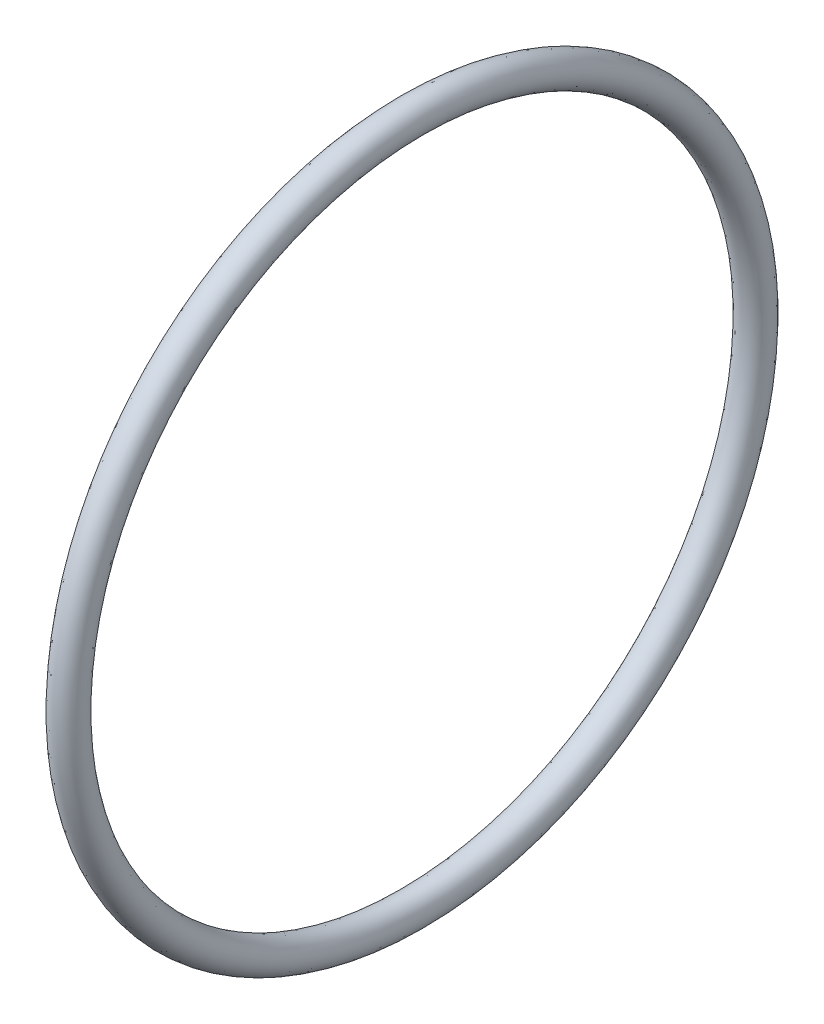
ISO-10303-21;
HEADER;
FILE_DESCRIPTION(('STEP AP214'),'2;1');
FILE_NAME('part.step','',(''),(''),'','','');
FILE_SCHEMA(('AUTOMOTIVE_DESIGN { 1 0 10303 214 1 1 1 1 }'));
ENDSEC;
DATA;
#1=APPLICATION_CONTEXT('core data for automotive mechanical design processes');
#2=APPLICATION_PROTOCOL_DEFINITION('international standard','automotive_design',2000,#1);
#3=PRODUCT_CONTEXT('',#1,'mechanical');
#4=PRODUCT('Part','Part','',(#3));
#5=PRODUCT_RELATED_PRODUCT_CATEGORY('part','',(#4));
#6=PRODUCT_DEFINITION_FORMATION('','',#4);
#7=PRODUCT_DEFINITION_CONTEXT('part definition',#1,'design');
#8=PRODUCT_DEFINITION('design','',#6,#7);
#9=PRODUCT_DEFINITION_SHAPE('','',#8);
#10=(LENGTH_UNIT() NAMED_UNIT(*) SI_UNIT(.MILLI.,.METRE.));
#11=(NAMED_UNIT(*) PLANE_ANGLE_UNIT() SI_UNIT($,.RADIAN.));
#12=(NAMED_UNIT(*) SI_UNIT($,.STERADIAN.) SOLID_ANGLE_UNIT());
#13=UNCERTAINTY_MEASURE_WITH_UNIT(LENGTH_MEASURE(1.E-05),#10,'distance_accuracy_value','');
#14=(GEOMETRIC_REPRESENTATION_CONTEXT(3) GLOBAL_UNCERTAINTY_ASSIGNED_CONTEXT((#13)) GLOBAL_UNIT_ASSIGNED_CONTEXT((#10,
#11,#12)) REPRESENTATION_CONTEXT('',''));
#15=CARTESIAN_POINT('',(0.,0.,0.));
#16=DIRECTION('',(0.,0.,1.));
#17=DIRECTION('',(1.,0.,0.));
#18=AXIS2_PLACEMENT_3D('',#15,#16,#17);
#19=CARTESIAN_POINT('',(0.,38.1381,0.));
#20=DIRECTION('',(0.,0.,1.));
#21=DIRECTION('',(0.,1.,0.));
#22=AXIS2_PLACEMENT_3D('',#19,#20,#21);
#23=ELLIPSE('',#22,1.7653,1.7653);
#24=CARTESIAN_POINT('',(0.,0.,0.));
#25=DIRECTION('',(1.,0.,0.));
#26=AXIS1_PLACEMENT('',#24,#25);
#27=SURFACE_OF_REVOLUTION('',#23,#26);
#28=ADVANCED_FACE('F33',(),#27,.F.);
#29=CLOSED_SHELL('',(#28));
#30=MANIFOLD_SOLID_BREP('B2',#29);
#31=ADVANCED_BREP_SHAPE_REPRESENTATION('',(#18,#30),#14);
#32=SHAPE_DEFINITION_REPRESENTATION(#9,#31);
ENDSEC;
END-ISO-10303-21;
